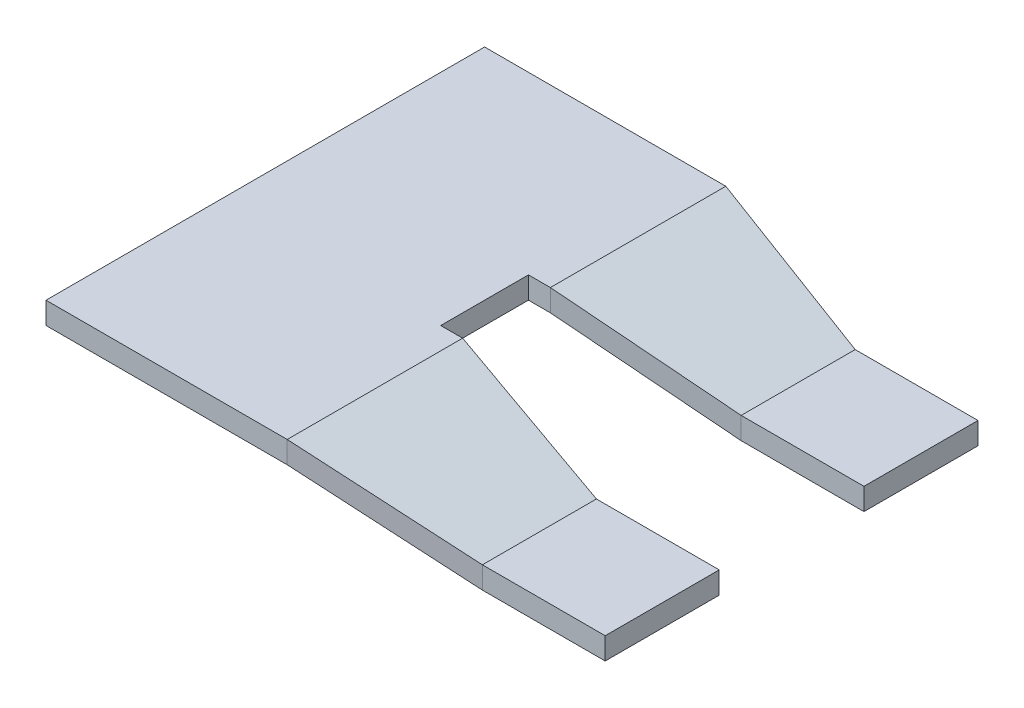
ISO-10303-21;
HEADER;
FILE_DESCRIPTION(('STEP AP214'),'2;1');
FILE_NAME('part.step','',(''),(''),'','','');
FILE_SCHEMA(('AUTOMOTIVE_DESIGN { 1 0 10303 214 1 1 1 1 }'));
ENDSEC;
DATA;
#1=APPLICATION_CONTEXT('core data for automotive mechanical design processes');
#2=APPLICATION_PROTOCOL_DEFINITION('international standard','automotive_design',2000,#1);
#3=PRODUCT_CONTEXT('',#1,'mechanical');
#4=PRODUCT('Part','Part','',(#3));
#5=PRODUCT_RELATED_PRODUCT_CATEGORY('part','',(#4));
#6=PRODUCT_DEFINITION_FORMATION('','',#4);
#7=PRODUCT_DEFINITION_CONTEXT('part definition',#1,'design');
#8=PRODUCT_DEFINITION('design','',#6,#7);
#9=PRODUCT_DEFINITION_SHAPE('','',#8);
#10=(LENGTH_UNIT() NAMED_UNIT(*) SI_UNIT(.MILLI.,.METRE.));
#11=(NAMED_UNIT(*) PLANE_ANGLE_UNIT() SI_UNIT($,.RADIAN.));
#12=(NAMED_UNIT(*) SI_UNIT($,.STERADIAN.) SOLID_ANGLE_UNIT());
#13=UNCERTAINTY_MEASURE_WITH_UNIT(LENGTH_MEASURE(1.E-05),#10,'distance_accuracy_value','');
#14=(GEOMETRIC_REPRESENTATION_CONTEXT(3) GLOBAL_UNCERTAINTY_ASSIGNED_CONTEXT((#13)) GLOBAL_UNIT_ASSIGNED_CONTEXT((#10,
#11,#12)) REPRESENTATION_CONTEXT('',''));
#15=CARTESIAN_POINT('',(0.,0.,0.));
#16=DIRECTION('',(0.,0.,1.));
#17=DIRECTION('',(1.,0.,0.));
#18=AXIS2_PLACEMENT_3D('',#15,#16,#17);
#19=CARTESIAN_POINT('',(0.,5.,-16.5));
#20=DIRECTION('',(0.,0.,-1.));
#21=DIRECTION('',(-1.,0.,0.));
#22=AXIS2_PLACEMENT_3D('',#19,#20,#21);
#23=PLANE('',#22);
#24=DIRECTION('',(1.,0.,0.));
#25=VECTOR('',#24,1.);
#26=CARTESIAN_POINT('',(0.,0.,-16.5));
#27=LINE('',#26,#25);
#28=CARTESIAN_POINT('',(92.,0.,-16.5));
#29=VERTEX_POINT('',#28);
#30=CARTESIAN_POINT('',(120.,0.,-16.5));
#31=VERTEX_POINT('',#30);
#32=EDGE_CURVE('E393',#29,#31,#27,.T.);
#33=ORIENTED_EDGE('',*,*,#32,.T.);
#34=DIRECTION('',(0.,-1.,0.));
#35=VECTOR('',#34,1.);
#36=CARTESIAN_POINT('',(120.,5.,-16.5));
#37=LINE('',#36,#35);
#38=CARTESIAN_POINT('',(120.,5.,-16.5));
#39=VERTEX_POINT('',#38);
#40=EDGE_CURVE('E63',#39,#31,#37,.T.);
#41=ORIENTED_EDGE('',*,*,#40,.F.);
#42=DIRECTION('',(1.,0.,0.));
#43=VECTOR('',#42,1.);
#44=CARTESIAN_POINT('',(0.,5.,-16.5));
#45=LINE('',#44,#43);
#46=CARTESIAN_POINT('',(92.,5.,-16.5));
#47=VERTEX_POINT('',#46);
#48=EDGE_CURVE('E86',#47,#39,#45,.T.);
#49=ORIENTED_EDGE('',*,*,#48,.F.);
#50=DIRECTION('',(0.,1.,0.));
#51=VECTOR('',#50,1.);
#52=CARTESIAN_POINT('',(92.,5.,-16.5));
#53=LINE('',#52,#51);
#54=EDGE_CURVE('E12',#47,#29,#53,.F.);
#55=ORIENTED_EDGE('',*,*,#54,.T.);
#56=EDGE_LOOP('',(#33,#41,#49,#55));
#57=FACE_BOUND('',#56,.T.);
#58=ADVANCED_FACE('F53',(#57),#23,.F.);
#59=CARTESIAN_POINT('',(120.,5.,0.));
#60=DIRECTION('',(1.,0.,0.));
#61=DIRECTION('',(0.,0.,-1.));
#62=AXIS2_PLACEMENT_3D('',#59,#60,#61);
#63=PLANE('',#62);
#64=DIRECTION('',(0.,0.,1.));
#65=VECTOR('',#64,1.);
#66=CARTESIAN_POINT('',(120.,0.,0.));
#67=LINE('',#66,#65);
#68=CARTESIAN_POINT('',(120.,0.,-42.5));
#69=VERTEX_POINT('',#68);
#70=EDGE_CURVE('E400',#69,#31,#67,.T.);
#71=ORIENTED_EDGE('',*,*,#70,.F.);
#72=DIRECTION('',(0.,-1.,0.));
#73=VECTOR('',#72,1.);
#74=CARTESIAN_POINT('',(120.,5.,-42.5));
#75=LINE('',#74,#73);
#76=CARTESIAN_POINT('',(120.,5.,-42.5));
#77=VERTEX_POINT('',#76);
#78=EDGE_CURVE('E91',#77,#69,#75,.T.);
#79=ORIENTED_EDGE('',*,*,#78,.F.);
#80=DIRECTION('',(0.,0.,1.));
#81=VECTOR('',#80,1.);
#82=CARTESIAN_POINT('',(120.,5.,0.));
#83=LINE('',#82,#81);
#84=EDGE_CURVE('E409',#77,#39,#83,.T.);
#85=ORIENTED_EDGE('',*,*,#84,.T.);
#86=ORIENTED_EDGE('',*,*,#40,.T.);
#87=EDGE_LOOP('',(#71,#79,#85,#86));
#88=FACE_BOUND('',#87,.T.);
#89=ADVANCED_FACE('F385',(#88),#63,.T.);
#90=CARTESIAN_POINT('',(0.,5.,-42.4999999999999));
#91=DIRECTION('',(0.,0.,-1.));
#92=DIRECTION('',(-1.,0.,0.));
#93=AXIS2_PLACEMENT_3D('',#90,#91,#92);
#94=PLANE('',#93);
#95=DIRECTION('',(1.,0.,0.));
#96=VECTOR('',#95,1.);
#97=CARTESIAN_POINT('',(0.,0.,-42.4999999999999));
#98=LINE('',#97,#96);
#99=CARTESIAN_POINT('',(92.,0.,-42.5));
#100=VERTEX_POINT('',#99);
#101=EDGE_CURVE('E403',#100,#69,#98,.T.);
#102=ORIENTED_EDGE('',*,*,#101,.F.);
#103=DIRECTION('',(0.,1.,0.));
#104=VECTOR('',#103,1.);
#105=CARTESIAN_POINT('',(92.,0.,-42.5));
#106=LINE('',#105,#104);
#107=CARTESIAN_POINT('',(92.,4.99999999999999,-42.5));
#108=VERTEX_POINT('',#107);
#109=EDGE_CURVE('E72',#108,#100,#106,.F.);
#110=ORIENTED_EDGE('',*,*,#109,.F.);
#111=DIRECTION('',(1.,0.,0.));
#112=VECTOR('',#111,1.);
#113=CARTESIAN_POINT('',(0.,5.,-42.4999999999999));
#114=LINE('',#113,#112);
#115=EDGE_CURVE('E412',#108,#77,#114,.T.);
#116=ORIENTED_EDGE('',*,*,#115,.T.);
#117=ORIENTED_EDGE('',*,*,#78,.T.);
#118=EDGE_LOOP('',(#102,#110,#116,#117));
#119=FACE_BOUND('',#118,.T.);
#120=ADVANCED_FACE('F389',(#119),#94,.T.);
#121=CARTESIAN_POINT('',(0.,5.,0.));
#122=DIRECTION('',(0.,1.,0.));
#123=DIRECTION('',(0.,0.,1.));
#124=AXIS2_PLACEMENT_3D('',#121,#122,#123);
#125=PLANE('',#124);
#126=DIRECTION('',(0.,0.,1.));
#127=VECTOR('',#126,1.);
#128=CARTESIAN_POINT('',(92.,5.,0.));
#129=LINE('',#128,#127);
#130=EDGE_CURVE('E405',#108,#47,#129,.T.);
#131=ORIENTED_EDGE('',*,*,#130,.T.);
#132=ORIENTED_EDGE('',*,*,#48,.T.);
#133=ORIENTED_EDGE('',*,*,#84,.F.);
#134=ORIENTED_EDGE('',*,*,#115,.F.);
#135=EDGE_LOOP('',(#131,#132,#133,#134));
#136=FACE_BOUND('',#135,.T.);
#137=ADVANCED_FACE('F305',(#136),#125,.T.);
#138=CARTESIAN_POINT('',(0.,0.,0.));
#139=DIRECTION('',(0.,1.,0.));
#140=DIRECTION('',(0.,0.,1.));
#141=AXIS2_PLACEMENT_3D('',#138,#139,#140);
#142=PLANE('',#141);
#143=DIRECTION('',(0.,0.,1.));
#144=VECTOR('',#143,1.);
#145=CARTESIAN_POINT('',(92.,0.,0.));
#146=LINE('',#145,#144);
#147=EDGE_CURVE('E322',#100,#29,#146,.T.);
#148=ORIENTED_EDGE('',*,*,#147,.F.);
#149=ORIENTED_EDGE('',*,*,#101,.T.);
#150=ORIENTED_EDGE('',*,*,#70,.T.);
#151=ORIENTED_EDGE('',*,*,#32,.F.);
#152=EDGE_LOOP('',(#148,#149,#150,#151));
#153=FACE_BOUND('',#152,.T.);
#154=ADVANCED_FACE('F364',(#153),#142,.F.);
#155=CARTESIAN_POINT('',(-0.0575730735163854,0.,-0.327723649247117));
#156=DIRECTION('',(-0.17302600448638,0.,-0.984917256307087));
#157=DIRECTION('',(-0.984917256307087,0.,0.17302600448638));
#158=AXIS2_PLACEMENT_3D('',#155,#156,#157);
#159=PLANE('',#158);
#160=DIRECTION('',(0.951773408959115,-0.257236056475436,-0.167203436709034));
#161=VECTOR('',#160,1.);
#162=CARTESIAN_POINT('',(55.,10.,-10.));
#163=LINE('',#162,#161);
#164=CARTESIAN_POINT('',(55.,10.,-10.));
#165=VERTEX_POINT('',#164);
#166=EDGE_CURVE('E284',#165,#29,#163,.T.);
#167=ORIENTED_EDGE('',*,*,#166,.T.);
#168=ORIENTED_EDGE('',*,*,#54,.F.);
#169=DIRECTION('',(0.951773408959115,-0.257236056475436,-0.167203436709034));
#170=VECTOR('',#169,1.);
#171=CARTESIAN_POINT('',(55.,15.,-10.));
#172=LINE('',#171,#170);
#173=CARTESIAN_POINT('',(55.,15.,-10.));
#174=VERTEX_POINT('',#173);
#175=EDGE_CURVE('E335',#174,#47,#172,.T.);
#176=ORIENTED_EDGE('',*,*,#175,.F.);
#177=DIRECTION('',(0.,-1.,0.));
#178=VECTOR('',#177,1.);
#179=CARTESIAN_POINT('',(55.,15.,-10.));
#180=LINE('',#179,#178);
#181=EDGE_CURVE('E349',#174,#165,#180,.T.);
#182=ORIENTED_EDGE('',*,*,#181,.T.);
#183=EDGE_LOOP('',(#167,#168,#176,#182));
#184=FACE_BOUND('',#183,.T.);
#185=ADVANCED_FACE('F355',(#184),#159,.F.);
#186=CARTESIAN_POINT('',(7.5221238938053,27.8318584070796,0.));
#187=DIRECTION('',(-0.260909025142775,-0.965363393028266,0.));
#188=DIRECTION('',(0.965363393028266,-0.260909025142775,0.));
#189=AXIS2_PLACEMENT_3D('',#186,#187,#188);
#190=PLANE('',#189);
#191=ORIENTED_EDGE('',*,*,#175,.T.);
#192=ORIENTED_EDGE('',*,*,#130,.F.);
#193=DIRECTION('',(0.947395259336639,-0.256052772793686,0.192039579595265));
#194=VECTOR('',#193,1.);
#195=CARTESIAN_POINT('',(55.,15.,-50.));
#196=LINE('',#195,#194);
#197=CARTESIAN_POINT('',(55.,15.,-50.));
#198=VERTEX_POINT('',#197);
#199=EDGE_CURVE('E314',#198,#108,#196,.T.);
#200=ORIENTED_EDGE('',*,*,#199,.F.);
#201=DIRECTION('',(0.,0.,1.));
#202=VECTOR('',#201,1.);
#203=CARTESIAN_POINT('',(55.,15.,-50.));
#204=LINE('',#203,#202);
#205=EDGE_CURVE('E56',#198,#174,#204,.T.);
#206=ORIENTED_EDGE('',*,*,#205,.T.);
#207=EDGE_LOOP('',(#191,#192,#200,#206));
#208=FACE_BOUND('',#207,.T.);
#209=ADVANCED_FACE('F297',(#208),#190,.F.);
#210=CARTESIAN_POINT('',(6.26276378488769,23.1722260040844,0.));
#211=DIRECTION('',(-0.260909025142775,-0.965363393028266,0.));
#212=DIRECTION('',(0.965363393028266,-0.260909025142775,0.));
#213=AXIS2_PLACEMENT_3D('',#210,#211,#212);
#214=PLANE('',#213);
#215=DIRECTION('',(0.947395259336639,-0.256052772793686,0.192039579595265));
#216=VECTOR('',#215,1.);
#217=CARTESIAN_POINT('',(55.,10.,-50.));
#218=LINE('',#217,#216);
#219=CARTESIAN_POINT('',(55.,10.,-50.));
#220=VERTEX_POINT('',#219);
#221=EDGE_CURVE('E323',#220,#100,#218,.T.);
#222=ORIENTED_EDGE('',*,*,#221,.T.);
#223=ORIENTED_EDGE('',*,*,#147,.T.);
#224=ORIENTED_EDGE('',*,*,#166,.F.);
#225=DIRECTION('',(0.,0.,-1.));
#226=VECTOR('',#225,1.);
#227=CARTESIAN_POINT('',(55.,10.,-50.));
#228=LINE('',#227,#226);
#229=EDGE_CURVE('E279',#165,#220,#228,.T.);
#230=ORIENTED_EDGE('',*,*,#229,.T.);
#231=EDGE_LOOP('',(#222,#223,#224,#230));
#232=FACE_BOUND('',#231,.T.);
#233=ADVANCED_FACE('F286',(#232),#214,.T.);
#234=CARTESIAN_POINT('',(11.9058059989476,0.,-58.735309594808));
#235=DIRECTION('',(0.198662427795257,0.,-0.980067977123268));
#236=DIRECTION('',(-0.980067977123268,0.,-0.198662427795257));
#237=AXIS2_PLACEMENT_3D('',#234,#235,#236);
#238=PLANE('',#237);
#239=ORIENTED_EDGE('',*,*,#199,.T.);
#240=ORIENTED_EDGE('',*,*,#109,.T.);
#241=ORIENTED_EDGE('',*,*,#221,.F.);
#242=DIRECTION('',(0.,1.,0.));
#243=VECTOR('',#242,1.);
#244=CARTESIAN_POINT('',(55.,15.,-50.));
#245=LINE('',#244,#243);
#246=EDGE_CURVE('E428',#220,#198,#245,.T.);
#247=ORIENTED_EDGE('',*,*,#246,.T.);
#248=EDGE_LOOP('',(#239,#240,#241,#247));
#249=FACE_BOUND('',#248,.T.);
#250=ADVANCED_FACE('F296',(#249),#238,.T.);
#251=CARTESIAN_POINT('',(0.,5.,16.5));
#252=DIRECTION('',(0.,0.,-1.));
#253=DIRECTION('',(-1.,0.,0.));
#254=AXIS2_PLACEMENT_3D('',#251,#252,#253);
#255=PLANE('',#254);
#256=DIRECTION('',(1.,0.,0.));
#257=VECTOR('',#256,1.);
#258=CARTESIAN_POINT('',(0.,0.,16.5));
#259=LINE('',#258,#257);
#260=CARTESIAN_POINT('',(92.,0.,16.5));
#261=VERTEX_POINT('',#260);
#262=CARTESIAN_POINT('',(120.,0.,16.5));
#263=VERTEX_POINT('',#262);
#264=EDGE_CURVE('E486',#261,#263,#259,.T.);
#265=ORIENTED_EDGE('',*,*,#264,.F.);
#266=DIRECTION('',(0.,1.,0.));
#267=VECTOR('',#266,1.);
#268=CARTESIAN_POINT('',(92.,0.,16.5));
#269=LINE('',#268,#267);
#270=CARTESIAN_POINT('',(92.,5.,16.5));
#271=VERTEX_POINT('',#270);
#272=EDGE_CURVE('E491',#271,#261,#269,.F.);
#273=ORIENTED_EDGE('',*,*,#272,.F.);
#274=DIRECTION('',(1.,0.,0.));
#275=VECTOR('',#274,1.);
#276=CARTESIAN_POINT('',(0.,5.,16.5));
#277=LINE('',#276,#275);
#278=CARTESIAN_POINT('',(120.,5.,16.5));
#279=VERTEX_POINT('',#278);
#280=EDGE_CURVE('E504',#271,#279,#277,.T.);
#281=ORIENTED_EDGE('',*,*,#280,.T.);
#282=DIRECTION('',(0.,-1.,0.));
#283=VECTOR('',#282,1.);
#284=CARTESIAN_POINT('',(120.,5.,16.5));
#285=LINE('',#284,#283);
#286=EDGE_CURVE('E587',#279,#263,#285,.T.);
#287=ORIENTED_EDGE('',*,*,#286,.T.);
#288=EDGE_LOOP('',(#265,#273,#281,#287));
#289=FACE_BOUND('',#288,.T.);
#290=ADVANCED_FACE('F303',(#289),#255,.T.);
#291=CARTESIAN_POINT('',(0.,5.,42.4999999999999));
#292=DIRECTION('',(0.,0.,-1.));
#293=DIRECTION('',(-1.,0.,0.));
#294=AXIS2_PLACEMENT_3D('',#291,#292,#293);
#295=PLANE('',#294);
#296=DIRECTION('',(1.,0.,0.));
#297=VECTOR('',#296,1.);
#298=CARTESIAN_POINT('',(0.,0.,42.4999999999999));
#299=LINE('',#298,#297);
#300=CARTESIAN_POINT('',(92.,0.,42.5));
#301=VERTEX_POINT('',#300);
#302=CARTESIAN_POINT('',(120.,0.,42.5));
#303=VERTEX_POINT('',#302);
#304=EDGE_CURVE('E591',#301,#303,#299,.T.);
#305=ORIENTED_EDGE('',*,*,#304,.T.);
#306=DIRECTION('',(0.,-1.,0.));
#307=VECTOR('',#306,1.);
#308=CARTESIAN_POINT('',(120.,5.,42.5));
#309=LINE('',#308,#307);
#310=CARTESIAN_POINT('',(120.,5.,42.5));
#311=VERTEX_POINT('',#310);
#312=EDGE_CURVE('E497',#311,#303,#309,.T.);
#313=ORIENTED_EDGE('',*,*,#312,.F.);
#314=DIRECTION('',(1.,0.,0.));
#315=VECTOR('',#314,1.);
#316=CARTESIAN_POINT('',(0.,5.,42.4999999999999));
#317=LINE('',#316,#315);
#318=CARTESIAN_POINT('',(92.,5.,42.5));
#319=VERTEX_POINT('',#318);
#320=EDGE_CURVE('E503',#319,#311,#317,.T.);
#321=ORIENTED_EDGE('',*,*,#320,.F.);
#322=DIRECTION('',(0.,1.,0.));
#323=VECTOR('',#322,1.);
#324=CARTESIAN_POINT('',(92.,5.,42.5));
#325=LINE('',#324,#323);
#326=EDGE_CURVE('E494',#319,#301,#325,.F.);
#327=ORIENTED_EDGE('',*,*,#326,.T.);
#328=EDGE_LOOP('',(#305,#313,#321,#327));
#329=FACE_BOUND('',#328,.T.);
#330=ADVANCED_FACE('F367',(#329),#295,.F.);
#331=CARTESIAN_POINT('',(120.,5.,0.));
#332=DIRECTION('',(1.,0.,0.));
#333=DIRECTION('',(0.,0.,-1.));
#334=AXIS2_PLACEMENT_3D('',#331,#332,#333);
#335=PLANE('',#334);
#336=DIRECTION('',(0.,0.,1.));
#337=VECTOR('',#336,1.);
#338=CARTESIAN_POINT('',(120.,0.,0.));
#339=LINE('',#338,#337);
#340=EDGE_CURVE('E588',#263,#303,#339,.T.);
#341=ORIENTED_EDGE('',*,*,#340,.F.);
#342=ORIENTED_EDGE('',*,*,#286,.F.);
#343=DIRECTION('',(0.,0.,1.));
#344=VECTOR('',#343,1.);
#345=CARTESIAN_POINT('',(120.,5.,0.));
#346=LINE('',#345,#344);
#347=EDGE_CURVE('E584',#279,#311,#346,.T.);
#348=ORIENTED_EDGE('',*,*,#347,.T.);
#349=ORIENTED_EDGE('',*,*,#312,.T.);
#350=EDGE_LOOP('',(#341,#342,#348,#349));
#351=FACE_BOUND('',#350,.T.);
#352=ADVANCED_FACE('F371',(#351),#335,.T.);
#353=CARTESIAN_POINT('',(0.,5.,0.));
#354=DIRECTION('',(0.,1.,0.));
#355=DIRECTION('',(0.,0.,1.));
#356=AXIS2_PLACEMENT_3D('',#353,#354,#355);
#357=PLANE('',#356);
#358=ORIENTED_EDGE('',*,*,#280,.F.);
#359=DIRECTION('',(0.,0.,1.));
#360=VECTOR('',#359,1.);
#361=CARTESIAN_POINT('',(92.,5.,0.));
#362=LINE('',#361,#360);
#363=EDGE_CURVE('E502',#271,#319,#362,.T.);
#364=ORIENTED_EDGE('',*,*,#363,.T.);
#365=ORIENTED_EDGE('',*,*,#320,.T.);
#366=ORIENTED_EDGE('',*,*,#347,.F.);
#367=EDGE_LOOP('',(#358,#364,#365,#366));
#368=FACE_BOUND('',#367,.T.);
#369=ADVANCED_FACE('F250',(#368),#357,.T.);
#370=CARTESIAN_POINT('',(0.,0.,0.));
#371=DIRECTION('',(0.,1.,0.));
#372=DIRECTION('',(0.,0.,1.));
#373=AXIS2_PLACEMENT_3D('',#370,#371,#372);
#374=PLANE('',#373);
#375=ORIENTED_EDGE('',*,*,#264,.T.);
#376=ORIENTED_EDGE('',*,*,#340,.T.);
#377=ORIENTED_EDGE('',*,*,#304,.F.);
#378=DIRECTION('',(0.,0.,1.));
#379=VECTOR('',#378,1.);
#380=CARTESIAN_POINT('',(92.,0.,0.));
#381=LINE('',#380,#379);
#382=EDGE_CURVE('E216',#261,#301,#381,.T.);
#383=ORIENTED_EDGE('',*,*,#382,.F.);
#384=EDGE_LOOP('',(#375,#376,#377,#383));
#385=FACE_BOUND('',#384,.T.);
#386=ADVANCED_FACE('F375',(#385),#374,.F.);
#387=CARTESIAN_POINT('',(11.9058059989476,0.,58.7353095948079));
#388=DIRECTION('',(-0.198662427795258,0.,-0.980067977123268));
#389=DIRECTION('',(-0.980067977123268,0.,0.198662427795258));
#390=AXIS2_PLACEMENT_3D('',#387,#388,#389);
#391=PLANE('',#390);
#392=DIRECTION('',(0.94739525933664,-0.256052772793686,-0.192039579595265));
#393=VECTOR('',#392,1.);
#394=CARTESIAN_POINT('',(55.,10.,50.));
#395=LINE('',#394,#393);
#396=CARTESIAN_POINT('',(55.,10.,50.));
#397=VERTEX_POINT('',#396);
#398=EDGE_CURVE('E206',#397,#301,#395,.T.);
#399=ORIENTED_EDGE('',*,*,#398,.T.);
#400=ORIENTED_EDGE('',*,*,#326,.F.);
#401=DIRECTION('',(0.94739525933664,-0.256052772793686,-0.192039579595265));
#402=VECTOR('',#401,1.);
#403=CARTESIAN_POINT('',(55.,15.,50.));
#404=LINE('',#403,#402);
#405=CARTESIAN_POINT('',(55.,15.,50.));
#406=VERTEX_POINT('',#405);
#407=EDGE_CURVE('E208',#406,#319,#404,.T.);
#408=ORIENTED_EDGE('',*,*,#407,.F.);
#409=DIRECTION('',(0.,-1.,0.));
#410=VECTOR('',#409,1.);
#411=CARTESIAN_POINT('',(55.,15.,50.));
#412=LINE('',#411,#410);
#413=EDGE_CURVE('E175',#406,#397,#412,.T.);
#414=ORIENTED_EDGE('',*,*,#413,.T.);
#415=EDGE_LOOP('',(#399,#400,#408,#414));
#416=FACE_BOUND('',#415,.T.);
#417=ADVANCED_FACE('F204',(#416),#391,.F.);
#418=CARTESIAN_POINT('',(7.52212389380529,27.8318584070796,0.));
#419=DIRECTION('',(-0.260909025142774,-0.965363393028266,0.));
#420=DIRECTION('',(0.965363393028266,-0.260909025142774,0.));
#421=AXIS2_PLACEMENT_3D('',#418,#419,#420);
#422=PLANE('',#421);
#423=ORIENTED_EDGE('',*,*,#407,.T.);
#424=ORIENTED_EDGE('',*,*,#363,.F.);
#425=DIRECTION('',(0.951773408959115,-0.257236056475436,0.167203436709033));
#426=VECTOR('',#425,1.);
#427=CARTESIAN_POINT('',(55.,15.,10.));
#428=LINE('',#427,#426);
#429=CARTESIAN_POINT('',(55.,15.,10.));
#430=VERTEX_POINT('',#429);
#431=EDGE_CURVE('E478',#430,#271,#428,.T.);
#432=ORIENTED_EDGE('',*,*,#431,.F.);
#433=DIRECTION('',(0.,0.,1.));
#434=VECTOR('',#433,1.);
#435=CARTESIAN_POINT('',(55.,15.,50.));
#436=LINE('',#435,#434);
#437=EDGE_CURVE('E217',#430,#406,#436,.T.);
#438=ORIENTED_EDGE('',*,*,#437,.T.);
#439=EDGE_LOOP('',(#423,#424,#432,#438));
#440=FACE_BOUND('',#439,.T.);
#441=ADVANCED_FACE('F243',(#440),#422,.F.);
#442=CARTESIAN_POINT('',(6.26276378488768,23.1722260040844,0.));
#443=DIRECTION('',(-0.260909025142775,-0.965363393028266,0.));
#444=DIRECTION('',(0.965363393028266,-0.260909025142775,0.));
#445=AXIS2_PLACEMENT_3D('',#442,#443,#444);
#446=PLANE('',#445);
#447=DIRECTION('',(0.951773408959115,-0.257236056475436,0.167203436709033));
#448=VECTOR('',#447,1.);
#449=CARTESIAN_POINT('',(55.,10.,10.));
#450=LINE('',#449,#448);
#451=CARTESIAN_POINT('',(55.,10.,10.));
#452=VERTEX_POINT('',#451);
#453=EDGE_CURVE('E219',#452,#261,#450,.T.);
#454=ORIENTED_EDGE('',*,*,#453,.T.);
#455=ORIENTED_EDGE('',*,*,#382,.T.);
#456=ORIENTED_EDGE('',*,*,#398,.F.);
#457=DIRECTION('',(0.,0.,-1.));
#458=VECTOR('',#457,1.);
#459=CARTESIAN_POINT('',(55.,10.,50.));
#460=LINE('',#459,#458);
#461=EDGE_CURVE('E186',#397,#452,#460,.T.);
#462=ORIENTED_EDGE('',*,*,#461,.T.);
#463=EDGE_LOOP('',(#454,#455,#456,#462));
#464=FACE_BOUND('',#463,.T.);
#465=ADVANCED_FACE('F214',(#464),#446,.T.);
#466=CARTESIAN_POINT('',(-0.05757307351639,0.,0.327723649247144));
#467=DIRECTION('',(0.17302600448638,0.,-0.984917256307086));
#468=DIRECTION('',(-0.984917256307087,0.,-0.17302600448638));
#469=AXIS2_PLACEMENT_3D('',#466,#467,#468);
#470=PLANE('',#469);
#471=ORIENTED_EDGE('',*,*,#431,.T.);
#472=ORIENTED_EDGE('',*,*,#272,.T.);
#473=ORIENTED_EDGE('',*,*,#453,.F.);
#474=DIRECTION('',(0.,1.,0.));
#475=VECTOR('',#474,1.);
#476=CARTESIAN_POINT('',(55.,15.,10.));
#477=LINE('',#476,#475);
#478=EDGE_CURVE('E197',#452,#430,#477,.T.);
#479=ORIENTED_EDGE('',*,*,#478,.T.);
#480=EDGE_LOOP('',(#471,#472,#473,#479));
#481=FACE_BOUND('',#480,.T.);
#482=ADVANCED_FACE('F242',(#481),#470,.T.);
#483=CARTESIAN_POINT('',(50.,15.,50.));
#484=DIRECTION('',(-1.,0.,0.));
#485=DIRECTION('',(0.,0.,1.));
#486=AXIS2_PLACEMENT_3D('',#483,#484,#485);
#487=PLANE('',#486);
#488=DIRECTION('',(0.,1.,0.));
#489=VECTOR('',#488,1.);
#490=CARTESIAN_POINT('',(50.,15.,10.));
#491=LINE('',#490,#489);
#492=CARTESIAN_POINT('',(50.,10.,10.));
#493=VERTEX_POINT('',#492);
#494=CARTESIAN_POINT('',(50.,15.,10.));
#495=VERTEX_POINT('',#494);
#496=EDGE_CURVE('E509',#493,#495,#491,.T.);
#497=ORIENTED_EDGE('',*,*,#496,.F.);
#498=DIRECTION('',(0.,0.,-1.));
#499=VECTOR('',#498,1.);
#500=CARTESIAN_POINT('',(50.,10.,50.));
#501=LINE('',#500,#499);
#502=CARTESIAN_POINT('',(50.,10.,-10.));
#503=VERTEX_POINT('',#502);
#504=EDGE_CURVE('E183',#493,#503,#501,.T.);
#505=ORIENTED_EDGE('',*,*,#504,.T.);
#506=DIRECTION('',(0.,-1.,0.));
#507=VECTOR('',#506,1.);
#508=CARTESIAN_POINT('',(50.,15.,-10.));
#509=LINE('',#508,#507);
#510=CARTESIAN_POINT('',(50.,15.,-10.));
#511=VERTEX_POINT('',#510);
#512=EDGE_CURVE('E786',#511,#503,#509,.T.);
#513=ORIENTED_EDGE('',*,*,#512,.F.);
#514=DIRECTION('',(0.,0.,-1.));
#515=VECTOR('',#514,1.);
#516=CARTESIAN_POINT('',(50.,15.,50.));
#517=LINE('',#516,#515);
#518=EDGE_CURVE('E421',#495,#511,#517,.T.);
#519=ORIENTED_EDGE('',*,*,#518,.F.);
#520=EDGE_LOOP('',(#497,#505,#513,#519));
#521=FACE_BOUND('',#520,.T.);
#522=ADVANCED_FACE('F248',(#521),#487,.F.);
#523=CARTESIAN_POINT('',(0.,15.,50.));
#524=DIRECTION('',(-1.,0.,0.));
#525=DIRECTION('',(0.,0.,1.));
#526=AXIS2_PLACEMENT_3D('',#523,#524,#525);
#527=PLANE('',#526);
#528=DIRECTION('',(0.,0.,-1.));
#529=VECTOR('',#528,1.);
#530=CARTESIAN_POINT('',(0.,10.,50.));
#531=LINE('',#530,#529);
#532=CARTESIAN_POINT('',(0.,10.,50.));
#533=VERTEX_POINT('',#532);
#534=CARTESIAN_POINT('',(0.,10.,-50.));
#535=VERTEX_POINT('',#534);
#536=EDGE_CURVE('E457',#533,#535,#531,.T.);
#537=ORIENTED_EDGE('',*,*,#536,.F.);
#538=DIRECTION('',(0.,-1.,0.));
#539=VECTOR('',#538,1.);
#540=CARTESIAN_POINT('',(0.,15.,50.));
#541=LINE('',#540,#539);
#542=CARTESIAN_POINT('',(0.,15.,50.));
#543=VERTEX_POINT('',#542);
#544=EDGE_CURVE('E178',#543,#533,#541,.T.);
#545=ORIENTED_EDGE('',*,*,#544,.F.);
#546=DIRECTION('',(0.,0.,-1.));
#547=VECTOR('',#546,1.);
#548=CARTESIAN_POINT('',(0.,15.,50.));
#549=LINE('',#548,#547);
#550=CARTESIAN_POINT('',(0.,15.,-50.));
#551=VERTEX_POINT('',#550);
#552=EDGE_CURVE('E182',#543,#551,#549,.T.);
#553=ORIENTED_EDGE('',*,*,#552,.T.);
#554=DIRECTION('',(0.,-1.,0.));
#555=VECTOR('',#554,1.);
#556=CARTESIAN_POINT('',(0.,15.,-50.));
#557=LINE('',#556,#555);
#558=EDGE_CURVE('E459',#551,#535,#557,.T.);
#559=ORIENTED_EDGE('',*,*,#558,.T.);
#560=EDGE_LOOP('',(#537,#545,#553,#559));
#561=FACE_BOUND('',#560,.T.);
#562=ADVANCED_FACE('F448',(#561),#527,.T.);
#563=CARTESIAN_POINT('',(0.,15.,50.));
#564=DIRECTION('',(0.,0.,-1.));
#565=DIRECTION('',(-1.,0.,0.));
#566=AXIS2_PLACEMENT_3D('',#563,#564,#565);
#567=PLANE('',#566);
#568=DIRECTION('',(1.,0.,0.));
#569=VECTOR('',#568,1.);
#570=CARTESIAN_POINT('',(0.,10.,50.));
#571=LINE('',#570,#569);
#572=EDGE_CURVE('E170',#533,#397,#571,.T.);
#573=ORIENTED_EDGE('',*,*,#572,.T.);
#574=ORIENTED_EDGE('',*,*,#413,.F.);
#575=DIRECTION('',(1.,0.,0.));
#576=VECTOR('',#575,1.);
#577=CARTESIAN_POINT('',(0.,15.,50.));
#578=LINE('',#577,#576);
#579=EDGE_CURVE('E471',#543,#406,#578,.T.);
#580=ORIENTED_EDGE('',*,*,#579,.F.);
#581=ORIENTED_EDGE('',*,*,#544,.T.);
#582=EDGE_LOOP('',(#573,#574,#580,#581));
#583=FACE_BOUND('',#582,.T.);
#584=ADVANCED_FACE('F172',(#583),#567,.F.);
#585=CARTESIAN_POINT('',(0.,15.,-50.));
#586=DIRECTION('',(0.,0.,-1.));
#587=DIRECTION('',(-1.,0.,0.));
#588=AXIS2_PLACEMENT_3D('',#585,#586,#587);
#589=PLANE('',#588);
#590=DIRECTION('',(1.,0.,0.));
#591=VECTOR('',#590,1.);
#592=CARTESIAN_POINT('',(0.,10.,-50.));
#593=LINE('',#592,#591);
#594=EDGE_CURVE('E434',#535,#220,#593,.T.);
#595=ORIENTED_EDGE('',*,*,#594,.F.);
#596=ORIENTED_EDGE('',*,*,#558,.F.);
#597=DIRECTION('',(1.,0.,0.));
#598=VECTOR('',#597,1.);
#599=CARTESIAN_POINT('',(0.,15.,-50.));
#600=LINE('',#599,#598);
#601=EDGE_CURVE('E418',#551,#198,#600,.T.);
#602=ORIENTED_EDGE('',*,*,#601,.T.);
#603=ORIENTED_EDGE('',*,*,#246,.F.);
#604=EDGE_LOOP('',(#595,#596,#602,#603));
#605=FACE_BOUND('',#604,.T.);
#606=ADVANCED_FACE('F436',(#605),#589,.T.);
#607=CARTESIAN_POINT('',(0.,15.,0.));
#608=DIRECTION('',(0.,-1.,0.));
#609=DIRECTION('',(0.,0.,-1.));
#610=AXIS2_PLACEMENT_3D('',#607,#608,#609);
#611=PLANE('',#610);
#612=ORIENTED_EDGE('',*,*,#552,.F.);
#613=ORIENTED_EDGE('',*,*,#579,.T.);
#614=ORIENTED_EDGE('',*,*,#437,.F.);
#615=DIRECTION('',(-1.,0.,0.));
#616=VECTOR('',#615,1.);
#617=CARTESIAN_POINT('',(55.,15.,10.));
#618=LINE('',#617,#616);
#619=EDGE_CURVE('E506',#430,#495,#618,.T.);
#620=ORIENTED_EDGE('',*,*,#619,.T.);
#621=ORIENTED_EDGE('',*,*,#518,.T.);
#622=DIRECTION('',(-1.,0.,0.));
#623=VECTOR('',#622,1.);
#624=CARTESIAN_POINT('',(55.,15.,-10.));
#625=LINE('',#624,#623);
#626=EDGE_CURVE('E460',#174,#511,#625,.T.);
#627=ORIENTED_EDGE('',*,*,#626,.F.);
#628=ORIENTED_EDGE('',*,*,#205,.F.);
#629=ORIENTED_EDGE('',*,*,#601,.F.);
#630=EDGE_LOOP('',(#612,#613,#614,#620,#621,#627,#628,#629));
#631=FACE_BOUND('',#630,.T.);
#632=ADVANCED_FACE('F446',(#631),#611,.F.);
#633=CARTESIAN_POINT('',(0.,10.,0.));
#634=DIRECTION('',(0.,-1.,0.));
#635=DIRECTION('',(0.,0.,-1.));
#636=AXIS2_PLACEMENT_3D('',#633,#634,#635);
#637=PLANE('',#636);
#638=ORIENTED_EDGE('',*,*,#536,.T.);
#639=ORIENTED_EDGE('',*,*,#594,.T.);
#640=ORIENTED_EDGE('',*,*,#229,.F.);
#641=DIRECTION('',(-1.,0.,0.));
#642=VECTOR('',#641,1.);
#643=CARTESIAN_POINT('',(55.,10.,-10.));
#644=LINE('',#643,#642);
#645=EDGE_CURVE('E463',#165,#503,#644,.T.);
#646=ORIENTED_EDGE('',*,*,#645,.T.);
#647=ORIENTED_EDGE('',*,*,#504,.F.);
#648=DIRECTION('',(-1.,0.,0.));
#649=VECTOR('',#648,1.);
#650=CARTESIAN_POINT('',(55.,10.,10.));
#651=LINE('',#650,#649);
#652=EDGE_CURVE('E190',#452,#493,#651,.T.);
#653=ORIENTED_EDGE('',*,*,#652,.F.);
#654=ORIENTED_EDGE('',*,*,#461,.F.);
#655=ORIENTED_EDGE('',*,*,#572,.F.);
#656=EDGE_LOOP('',(#638,#639,#640,#646,#647,#653,#654,#655));
#657=FACE_BOUND('',#656,.T.);
#658=ADVANCED_FACE('F188',(#657),#637,.T.);
#659=CARTESIAN_POINT('',(55.,15.,-10.));
#660=DIRECTION('',(0.,0.,-1.));
#661=DIRECTION('',(-1.,0.,0.));
#662=AXIS2_PLACEMENT_3D('',#659,#660,#661);
#663=PLANE('',#662);
#664=ORIENTED_EDGE('',*,*,#512,.T.);
#665=ORIENTED_EDGE('',*,*,#645,.F.);
#666=ORIENTED_EDGE('',*,*,#181,.F.);
#667=ORIENTED_EDGE('',*,*,#626,.T.);
#668=EDGE_LOOP('',(#664,#665,#666,#667));
#669=FACE_BOUND('',#668,.T.);
#670=ADVANCED_FACE('F529',(#669),#663,.F.);
#671=CARTESIAN_POINT('',(55.,15.,10.));
#672=DIRECTION('',(0.,0.,1.));
#673=DIRECTION('',(1.,0.,0.));
#674=AXIS2_PLACEMENT_3D('',#671,#672,#673);
#675=PLANE('',#674);
#676=ORIENTED_EDGE('',*,*,#496,.T.);
#677=ORIENTED_EDGE('',*,*,#619,.F.);
#678=ORIENTED_EDGE('',*,*,#478,.F.);
#679=ORIENTED_EDGE('',*,*,#652,.T.);
#680=EDGE_LOOP('',(#676,#677,#678,#679));
#681=FACE_BOUND('',#680,.T.);
#682=ADVANCED_FACE('F520',(#681),#675,.F.);
#683=CLOSED_SHELL('',(#58,#89,#120,#137,#154,#185,#209,#233,#250,#290,#330,#352,#369,#386,#417,
#441,#465,#482,#522,#562,#584,#606,#632,#658,#670,#682));
#684=MANIFOLD_SOLID_BREP('B2',#683);
#685=ADVANCED_BREP_SHAPE_REPRESENTATION('',(#18,#684),#14);
#686=SHAPE_DEFINITION_REPRESENTATION(#9,#685);
ENDSEC;
END-ISO-10303-21;
